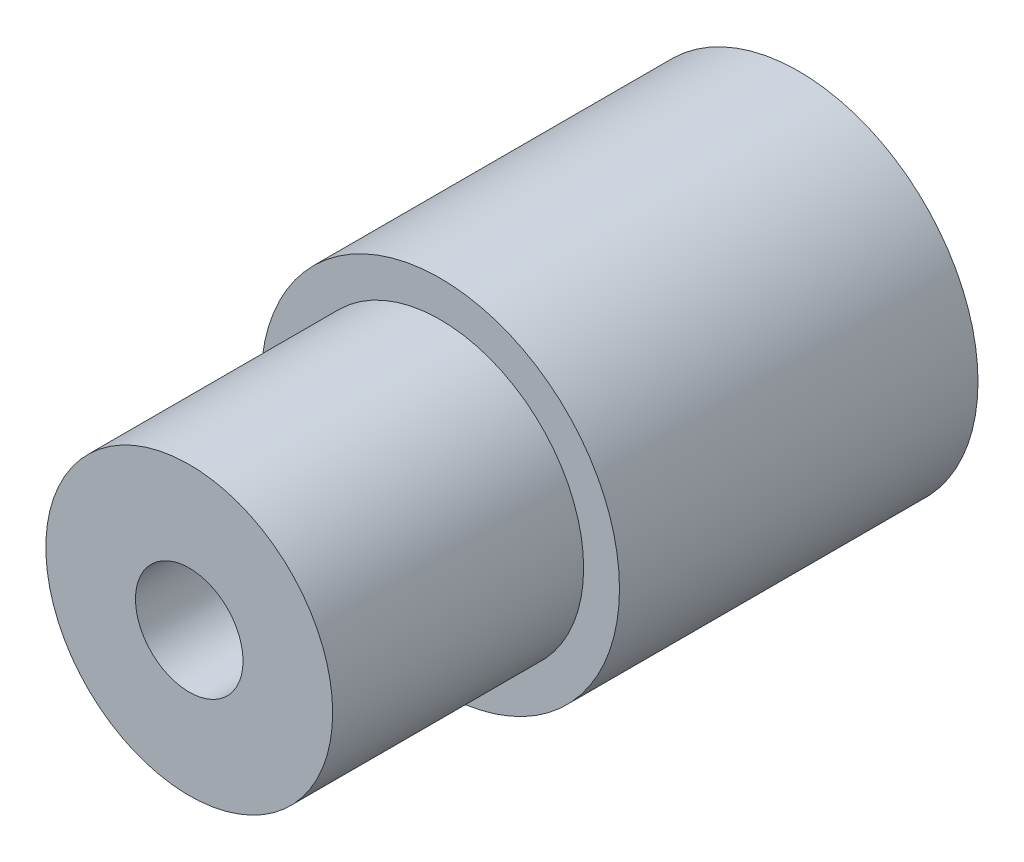
ISO-10303-21;
HEADER;
FILE_DESCRIPTION(('STEP AP214'),'2;1');
FILE_NAME('part.step','',(''),(''),'','','');
FILE_SCHEMA(('AUTOMOTIVE_DESIGN { 1 0 10303 214 1 1 1 1 }'));
ENDSEC;
DATA;
#1=APPLICATION_CONTEXT('core data for automotive mechanical design processes');
#2=APPLICATION_PROTOCOL_DEFINITION('international standard','automotive_design',2000,#1);
#3=PRODUCT_CONTEXT('',#1,'mechanical');
#4=PRODUCT('Part','Part','',(#3));
#5=PRODUCT_RELATED_PRODUCT_CATEGORY('part','',(#4));
#6=PRODUCT_DEFINITION_FORMATION('','',#4);
#7=PRODUCT_DEFINITION_CONTEXT('part definition',#1,'design');
#8=PRODUCT_DEFINITION('design','',#6,#7);
#9=PRODUCT_DEFINITION_SHAPE('','',#8);
#10=(LENGTH_UNIT() NAMED_UNIT(*) SI_UNIT(.MILLI.,.METRE.));
#11=(NAMED_UNIT(*) PLANE_ANGLE_UNIT() SI_UNIT($,.RADIAN.));
#12=(NAMED_UNIT(*) SI_UNIT($,.STERADIAN.) SOLID_ANGLE_UNIT());
#13=UNCERTAINTY_MEASURE_WITH_UNIT(LENGTH_MEASURE(1.E-05),#10,'distance_accuracy_value','');
#14=(GEOMETRIC_REPRESENTATION_CONTEXT(3) GLOBAL_UNCERTAINTY_ASSIGNED_CONTEXT((#13)) GLOBAL_UNIT_ASSIGNED_CONTEXT((#10,
#11,#12)) REPRESENTATION_CONTEXT('',''));
#15=CARTESIAN_POINT('',(0.,0.,0.));
#16=DIRECTION('',(0.,0.,1.));
#17=DIRECTION('',(1.,0.,0.));
#18=AXIS2_PLACEMENT_3D('',#15,#16,#17);
#19=CARTESIAN_POINT('',(0.,0.,10.));
#20=DIRECTION('',(0.,0.,1.));
#21=DIRECTION('',(1.,0.,0.));
#22=AXIS2_PLACEMENT_3D('',#19,#20,#21);
#23=PLANE('',#22);
#24=CARTESIAN_POINT('',(0.,0.,10.));
#25=DIRECTION('',(0.,0.,1.));
#26=DIRECTION('',(1.,0.,0.));
#27=AXIS2_PLACEMENT_3D('',#24,#25,#26);
#28=CIRCLE('',#27,4.);
#29=CARTESIAN_POINT('',(4.,0.,10.));
#30=VERTEX_POINT('',#29);
#31=EDGE_CURVE('E10',#30,#30,#28,.T.);
#32=ORIENTED_EDGE('',*,*,#31,.F.);
#33=EDGE_LOOP('',(#32));
#34=FACE_BOUND('',#33,.T.);
#35=CARTESIAN_POINT('',(0.,0.,10.));
#36=DIRECTION('',(0.,0.,1.));
#37=DIRECTION('',(1.,0.,0.));
#38=AXIS2_PLACEMENT_3D('',#35,#36,#37);
#39=CIRCLE('',#38,5.);
#40=CARTESIAN_POINT('',(5.,0.,10.));
#41=VERTEX_POINT('',#40);
#42=EDGE_CURVE('E50',#41,#41,#39,.T.);
#43=ORIENTED_EDGE('',*,*,#42,.T.);
#44=EDGE_LOOP('',(#43));
#45=FACE_BOUND('',#44,.T.);
#46=ADVANCED_FACE('F41',(#34,#45),#23,.T.);
#47=CARTESIAN_POINT('',(0.,0.,0.));
#48=DIRECTION('',(0.,0.,1.));
#49=DIRECTION('',(1.,0.,0.));
#50=AXIS2_PLACEMENT_3D('',#47,#48,#49);
#51=PLANE('',#50);
#52=CARTESIAN_POINT('',(0.,0.,0.));
#53=DIRECTION('',(0.,0.,1.));
#54=DIRECTION('',(1.,0.,0.));
#55=AXIS2_PLACEMENT_3D('',#52,#53,#54);
#56=CIRCLE('',#55,5.);
#57=CARTESIAN_POINT('',(5.,0.,0.));
#58=VERTEX_POINT('',#57);
#59=EDGE_CURVE('E45',#58,#58,#56,.T.);
#60=ORIENTED_EDGE('',*,*,#59,.F.);
#61=EDGE_LOOP('',(#60));
#62=FACE_BOUND('',#61,.T.);
#63=CARTESIAN_POINT('',(0.,0.,0.));
#64=DIRECTION('',(0.,0.,1.));
#65=DIRECTION('',(1.,0.,0.));
#66=AXIS2_PLACEMENT_3D('',#63,#64,#65);
#67=CIRCLE('',#66,1.5);
#68=CARTESIAN_POINT('',(1.5,0.,0.));
#69=VERTEX_POINT('',#68);
#70=EDGE_CURVE('E60',#69,#69,#67,.T.);
#71=ORIENTED_EDGE('',*,*,#70,.T.);
#72=EDGE_LOOP('',(#71));
#73=FACE_BOUND('',#72,.T.);
#74=ADVANCED_FACE('F91',(#62,#73),#51,.F.);
#75=CARTESIAN_POINT('',(0.,0.,10.));
#76=DIRECTION('',(0.,0.,-1.));
#77=DIRECTION('',(-1.,0.,0.));
#78=AXIS2_PLACEMENT_3D('',#75,#76,#77);
#79=CYLINDRICAL_SURFACE('',#78,5.);
#80=ORIENTED_EDGE('',*,*,#42,.F.);
#81=EDGE_LOOP('',(#80));
#82=FACE_BOUND('',#81,.T.);
#83=ORIENTED_EDGE('',*,*,#59,.T.);
#84=EDGE_LOOP('',(#83));
#85=FACE_BOUND('',#84,.T.);
#86=ADVANCED_FACE('F43',(#82,#85),#79,.T.);
#87=CARTESIAN_POINT('',(0.,0.,10.));
#88=DIRECTION('',(0.,0.,-1.));
#89=DIRECTION('',(-1.,0.,0.));
#90=AXIS2_PLACEMENT_3D('',#87,#88,#89);
#91=CYLINDRICAL_SURFACE('',#90,1.5);
#92=ORIENTED_EDGE('',*,*,#70,.F.);
#93=EDGE_LOOP('',(#92));
#94=FACE_BOUND('',#93,.T.);
#95=CARTESIAN_POINT('',(0.,0.,17.));
#96=DIRECTION('',(0.,0.,1.));
#97=DIRECTION('',(1.,0.,0.));
#98=AXIS2_PLACEMENT_3D('',#95,#96,#97);
#99=CIRCLE('',#98,1.5);
#100=CARTESIAN_POINT('',(1.5,0.,17.));
#101=VERTEX_POINT('',#100);
#102=EDGE_CURVE('E69',#101,#101,#99,.T.);
#103=ORIENTED_EDGE('',*,*,#102,.T.);
#104=EDGE_LOOP('',(#103));
#105=FACE_BOUND('',#104,.T.);
#106=ADVANCED_FACE('F76',(#94,#105),#91,.F.);
#107=CARTESIAN_POINT('',(0.,0.,17.));
#108=DIRECTION('',(0.,0.,1.));
#109=DIRECTION('',(1.,0.,0.));
#110=AXIS2_PLACEMENT_3D('',#107,#108,#109);
#111=PLANE('',#110);
#112=CARTESIAN_POINT('',(0.,0.,17.));
#113=DIRECTION('',(0.,0.,1.));
#114=DIRECTION('',(1.,0.,0.));
#115=AXIS2_PLACEMENT_3D('',#112,#113,#114);
#116=CIRCLE('',#115,4.);
#117=CARTESIAN_POINT('',(4.,0.,17.));
#118=VERTEX_POINT('',#117);
#119=EDGE_CURVE('E58',#118,#118,#116,.T.);
#120=ORIENTED_EDGE('',*,*,#119,.T.);
#121=EDGE_LOOP('',(#120));
#122=FACE_BOUND('',#121,.T.);
#123=ORIENTED_EDGE('',*,*,#102,.F.);
#124=EDGE_LOOP('',(#123));
#125=FACE_BOUND('',#124,.T.);
#126=ADVANCED_FACE('F78',(#122,#125),#111,.T.);
#127=CARTESIAN_POINT('',(0.,0.,17.));
#128=DIRECTION('',(0.,0.,-1.));
#129=DIRECTION('',(-1.,0.,0.));
#130=AXIS2_PLACEMENT_3D('',#127,#128,#129);
#131=CYLINDRICAL_SURFACE('',#130,4.);
#132=ORIENTED_EDGE('',*,*,#119,.F.);
#133=EDGE_LOOP('',(#132));
#134=FACE_BOUND('',#133,.T.);
#135=ORIENTED_EDGE('',*,*,#31,.T.);
#136=EDGE_LOOP('',(#135));
#137=FACE_BOUND('',#136,.T.);
#138=ADVANCED_FACE('F80',(#134,#137),#131,.T.);
#139=CLOSED_SHELL('',(#46,#74,#86,#106,#126,#138));
#140=MANIFOLD_SOLID_BREP('B2',#139);
#141=ADVANCED_BREP_SHAPE_REPRESENTATION('',(#18,#140),#14);
#142=SHAPE_DEFINITION_REPRESENTATION(#9,#141);
ENDSEC;
END-ISO-10303-21;
